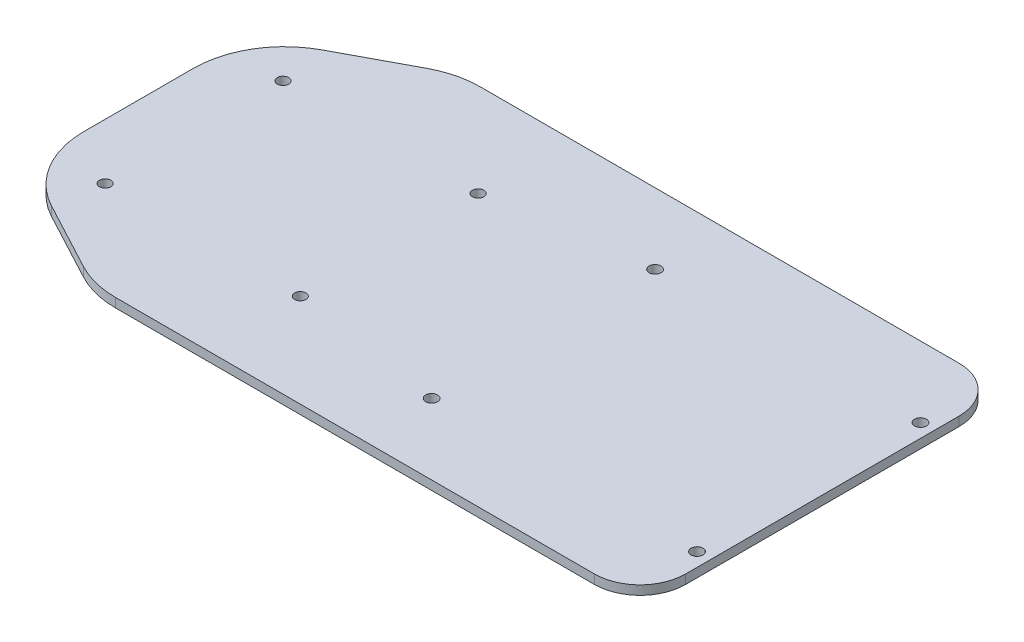
ISO-10303-21;
HEADER;
FILE_DESCRIPTION(('STEP AP214'),'2;1');
FILE_NAME('part.step','',(''),(''),'','','');
FILE_SCHEMA(('AUTOMOTIVE_DESIGN { 1 0 10303 214 1 1 1 1 }'));
ENDSEC;
DATA;
#1=APPLICATION_CONTEXT('core data for automotive mechanical design processes');
#2=APPLICATION_PROTOCOL_DEFINITION('international standard','automotive_design',2000,#1);
#3=PRODUCT_CONTEXT('',#1,'mechanical');
#4=PRODUCT('Part','Part','',(#3));
#5=PRODUCT_RELATED_PRODUCT_CATEGORY('part','',(#4));
#6=PRODUCT_DEFINITION_FORMATION('','',#4);
#7=PRODUCT_DEFINITION_CONTEXT('part definition',#1,'design');
#8=PRODUCT_DEFINITION('design','',#6,#7);
#9=PRODUCT_DEFINITION_SHAPE('','',#8);
#10=(LENGTH_UNIT() NAMED_UNIT(*) SI_UNIT(.MILLI.,.METRE.));
#11=(NAMED_UNIT(*) PLANE_ANGLE_UNIT() SI_UNIT($,.RADIAN.));
#12=(NAMED_UNIT(*) SI_UNIT($,.STERADIAN.) SOLID_ANGLE_UNIT());
#13=UNCERTAINTY_MEASURE_WITH_UNIT(LENGTH_MEASURE(1.E-05),#10,'distance_accuracy_value','');
#14=(GEOMETRIC_REPRESENTATION_CONTEXT(3) GLOBAL_UNCERTAINTY_ASSIGNED_CONTEXT((#13)) GLOBAL_UNIT_ASSIGNED_CONTEXT((#10,
#11,#12)) REPRESENTATION_CONTEXT('',''));
#15=CARTESIAN_POINT('',(0.,0.,0.));
#16=DIRECTION('',(0.,0.,1.));
#17=DIRECTION('',(1.,0.,0.));
#18=AXIS2_PLACEMENT_3D('',#15,#16,#17);
#19=CARTESIAN_POINT('',(0.,2.,0.));
#20=DIRECTION('',(0.,-1.,0.));
#21=DIRECTION('',(0.,0.,-1.));
#22=AXIS2_PLACEMENT_3D('',#19,#20,#21);
#23=PLANE('',#22);
#24=CARTESIAN_POINT('',(72.,2.,-24.5));
#25=DIRECTION('',(0.,1.,0.));
#26=DIRECTION('',(0.,0.,-1.));
#27=AXIS2_PLACEMENT_3D('',#24,#25,#26);
#28=CIRCLE('',#27,1.29999999999999);
#29=CARTESIAN_POINT('',(72.,2.,-25.8));
#30=VERTEX_POINT('',#29);
#31=EDGE_CURVE('E300',#30,#30,#28,.T.);
#32=ORIENTED_EDGE('',*,*,#31,.F.);
#33=EDGE_LOOP('',(#32));
#34=FACE_BOUND('',#33,.T.);
#35=CARTESIAN_POINT('',(13.8,2.,24.5));
#36=DIRECTION('',(0.,1.,0.));
#37=DIRECTION('',(0.,0.,-1.));
#38=AXIS2_PLACEMENT_3D('',#35,#36,#37);
#39=CIRCLE('',#38,1.3);
#40=CARTESIAN_POINT('',(13.8,2.,23.2));
#41=VERTEX_POINT('',#40);
#42=EDGE_CURVE('E309',#41,#41,#39,.T.);
#43=ORIENTED_EDGE('',*,*,#42,.F.);
#44=EDGE_LOOP('',(#43));
#45=FACE_BOUND('',#44,.T.);
#46=CARTESIAN_POINT('',(72.,2.,24.5));
#47=DIRECTION('',(0.,1.,0.));
#48=DIRECTION('',(0.,0.,1.));
#49=AXIS2_PLACEMENT_3D('',#46,#47,#48);
#50=CIRCLE('',#49,1.29999999999999);
#51=CARTESIAN_POINT('',(72.,2.,25.8));
#52=VERTEX_POINT('',#51);
#53=EDGE_CURVE('E285',#52,#52,#50,.T.);
#54=ORIENTED_EDGE('',*,*,#53,.F.);
#55=EDGE_LOOP('',(#54));
#56=FACE_BOUND('',#55,.T.);
#57=CARTESIAN_POINT('',(13.8,2.,-24.5));
#58=DIRECTION('',(0.,1.,0.));
#59=DIRECTION('',(0.,0.,1.));
#60=AXIS2_PLACEMENT_3D('',#57,#58,#59);
#61=CIRCLE('',#60,1.3);
#62=CARTESIAN_POINT('',(13.8,2.,-23.2));
#63=VERTEX_POINT('',#62);
#64=EDGE_CURVE('E304',#63,#63,#61,.T.);
#65=ORIENTED_EDGE('',*,*,#64,.F.);
#66=EDGE_LOOP('',(#65));
#67=FACE_BOUND('',#66,.T.);
#68=DIRECTION('',(0.,0.,-1.));
#69=VECTOR('',#68,1.);
#70=CARTESIAN_POINT('',(75.,2.,40.));
#71=LINE('',#70,#69);
#72=CARTESIAN_POINT('',(75.,2.,30.));
#73=VERTEX_POINT('',#72);
#74=CARTESIAN_POINT('',(75.,2.,-30.));
#75=VERTEX_POINT('',#74);
#76=EDGE_CURVE('E237',#73,#75,#71,.T.);
#77=ORIENTED_EDGE('',*,*,#76,.T.);
#78=CARTESIAN_POINT('',(65.,2.,-30.));
#79=DIRECTION('',(0.,-1.,0.));
#80=DIRECTION('',(0.,0.,-1.));
#81=AXIS2_PLACEMENT_3D('',#78,#79,#80);
#82=CIRCLE('',#81,10.);
#83=CARTESIAN_POINT('',(65.,2.,-40.));
#84=VERTEX_POINT('',#83);
#85=EDGE_CURVE('E51',#75,#84,#82,.F.);
#86=ORIENTED_EDGE('',*,*,#85,.T.);
#87=DIRECTION('',(-1.,0.,0.));
#88=VECTOR('',#87,1.);
#89=CARTESIAN_POINT('',(-75.,2.,-40.));
#90=LINE('',#89,#88);
#91=CARTESIAN_POINT('',(-40.,2.,-40.));
#92=VERTEX_POINT('',#91);
#93=EDGE_CURVE('E236',#84,#92,#90,.T.);
#94=ORIENTED_EDGE('',*,*,#93,.T.);
#95=CARTESIAN_POINT('',(-40.,2.,-20.));
#96=DIRECTION('',(0.,-1.,0.));
#97=DIRECTION('',(0.,0.,-1.));
#98=AXIS2_PLACEMENT_3D('',#95,#96,#97);
#99=CIRCLE('',#98,20.);
#100=CARTESIAN_POINT('',(-49.4117647058824,2.,-37.6470588235294));
#101=VERTEX_POINT('',#100);
#102=EDGE_CURVE('E163',#92,#101,#99,.F.);
#103=ORIENTED_EDGE('',*,*,#102,.T.);
#104=DIRECTION('',(0.882352941176471,0.,-0.470588235294118));
#105=VECTOR('',#104,1.);
#106=CARTESIAN_POINT('',(-45.,2.,-40.));
#107=LINE('',#106,#105);
#108=CARTESIAN_POINT('',(-64.4117647058824,2.,-29.6470588235294));
#109=VERTEX_POINT('',#108);
#110=EDGE_CURVE('E280',#109,#101,#107,.T.);
#111=ORIENTED_EDGE('',*,*,#110,.F.);
#112=CARTESIAN_POINT('',(-55.,2.,-12.));
#113=DIRECTION('',(0.,-1.,0.));
#114=DIRECTION('',(0.,0.,-1.));
#115=AXIS2_PLACEMENT_3D('',#112,#113,#114);
#116=CIRCLE('',#115,20.);
#117=CARTESIAN_POINT('',(-75.,2.,-12.));
#118=VERTEX_POINT('',#117);
#119=EDGE_CURVE('E180',#109,#118,#116,.F.);
#120=ORIENTED_EDGE('',*,*,#119,.T.);
#121=DIRECTION('',(0.,0.,1.));
#122=VECTOR('',#121,1.);
#123=CARTESIAN_POINT('',(-75.,2.,40.));
#124=LINE('',#123,#122);
#125=CARTESIAN_POINT('',(-75.,2.,12.));
#126=VERTEX_POINT('',#125);
#127=EDGE_CURVE('E172',#118,#126,#124,.T.);
#128=ORIENTED_EDGE('',*,*,#127,.T.);
#129=CARTESIAN_POINT('',(-55.,2.,12.));
#130=DIRECTION('',(0.,-1.,0.));
#131=DIRECTION('',(0.,0.,-1.));
#132=AXIS2_PLACEMENT_3D('',#129,#130,#131);
#133=CIRCLE('',#132,20.);
#134=CARTESIAN_POINT('',(-64.4117647058824,2.,29.6470588235294));
#135=VERTEX_POINT('',#134);
#136=EDGE_CURVE('E165',#126,#135,#133,.F.);
#137=ORIENTED_EDGE('',*,*,#136,.T.);
#138=DIRECTION('',(-0.882352941176471,0.,-0.470588235294118));
#139=VECTOR('',#138,1.);
#140=CARTESIAN_POINT('',(-45.,2.,40.));
#141=LINE('',#140,#139);
#142=CARTESIAN_POINT('',(-49.4117647058824,2.,37.6470588235294));
#143=VERTEX_POINT('',#142);
#144=EDGE_CURVE('E287',#143,#135,#141,.T.);
#145=ORIENTED_EDGE('',*,*,#144,.F.);
#146=CARTESIAN_POINT('',(-40.,2.,20.));
#147=DIRECTION('',(0.,-1.,0.));
#148=DIRECTION('',(0.,0.,-1.));
#149=AXIS2_PLACEMENT_3D('',#146,#147,#148);
#150=CIRCLE('',#149,20.);
#151=CARTESIAN_POINT('',(-40.,2.,40.));
#152=VERTEX_POINT('',#151);
#153=EDGE_CURVE('E170',#143,#152,#150,.F.);
#154=ORIENTED_EDGE('',*,*,#153,.T.);
#155=DIRECTION('',(1.,0.,0.));
#156=VECTOR('',#155,1.);
#157=CARTESIAN_POINT('',(-75.,2.,40.));
#158=LINE('',#157,#156);
#159=CARTESIAN_POINT('',(65.,2.,40.));
#160=VERTEX_POINT('',#159);
#161=EDGE_CURVE('E166',#152,#160,#158,.T.);
#162=ORIENTED_EDGE('',*,*,#161,.T.);
#163=CARTESIAN_POINT('',(65.,2.,30.));
#164=DIRECTION('',(0.,-1.,0.));
#165=DIRECTION('',(0.,0.,-1.));
#166=AXIS2_PLACEMENT_3D('',#163,#164,#165);
#167=CIRCLE('',#166,10.);
#168=EDGE_CURVE('E230',#160,#73,#167,.F.);
#169=ORIENTED_EDGE('',*,*,#168,.T.);
#170=EDGE_LOOP('',(#77,#86,#94,#103,#111,#120,#128,#137,#145,#154,#162,#169));
#171=FACE_BOUND('',#170,.T.);
#172=CARTESIAN_POINT('',(-62.8,2.,-19.5));
#173=DIRECTION('',(0.,1.,0.));
#174=DIRECTION('',(0.,0.,1.));
#175=AXIS2_PLACEMENT_3D('',#172,#173,#174);
#176=CIRCLE('',#175,1.25);
#177=CARTESIAN_POINT('',(-62.8,2.,-18.25));
#178=VERTEX_POINT('',#177);
#179=EDGE_CURVE('E246',#178,#178,#176,.T.);
#180=ORIENTED_EDGE('',*,*,#179,.F.);
#181=EDGE_LOOP('',(#180));
#182=FACE_BOUND('',#181,.T.);
#183=CARTESIAN_POINT('',(-20.,2.,-19.5));
#184=DIRECTION('',(0.,1.,0.));
#185=DIRECTION('',(0.,0.,-1.));
#186=AXIS2_PLACEMENT_3D('',#183,#184,#185);
#187=CIRCLE('',#186,1.25);
#188=CARTESIAN_POINT('',(-20.,2.,-20.75));
#189=VERTEX_POINT('',#188);
#190=EDGE_CURVE('E340',#189,#189,#187,.T.);
#191=ORIENTED_EDGE('',*,*,#190,.F.);
#192=EDGE_LOOP('',(#191));
#193=FACE_BOUND('',#192,.T.);
#194=CARTESIAN_POINT('',(-20.,2.,19.5));
#195=DIRECTION('',(0.,1.,0.));
#196=DIRECTION('',(0.,0.,1.));
#197=AXIS2_PLACEMENT_3D('',#194,#195,#196);
#198=CIRCLE('',#197,1.25);
#199=CARTESIAN_POINT('',(-20.,2.,20.75));
#200=VERTEX_POINT('',#199);
#201=EDGE_CURVE('E332',#200,#200,#198,.T.);
#202=ORIENTED_EDGE('',*,*,#201,.F.);
#203=EDGE_LOOP('',(#202));
#204=FACE_BOUND('',#203,.T.);
#205=CARTESIAN_POINT('',(-62.8,2.,19.5));
#206=DIRECTION('',(0.,1.,0.));
#207=DIRECTION('',(0.,0.,-1.));
#208=AXIS2_PLACEMENT_3D('',#205,#206,#207);
#209=CIRCLE('',#208,1.25);
#210=CARTESIAN_POINT('',(-62.8,2.,18.25));
#211=VERTEX_POINT('',#210);
#212=EDGE_CURVE('E324',#211,#211,#209,.T.);
#213=ORIENTED_EDGE('',*,*,#212,.F.);
#214=EDGE_LOOP('',(#213));
#215=FACE_BOUND('',#214,.T.);
#216=ADVANCED_FACE('F42',(#34,#45,#56,#67,#171,#182,#193,#204,#215),#23,.F.);
#217=CARTESIAN_POINT('',(0.,0.,0.));
#218=DIRECTION('',(0.,-1.,0.));
#219=DIRECTION('',(0.,0.,-1.));
#220=AXIS2_PLACEMENT_3D('',#217,#218,#219);
#221=PLANE('',#220);
#222=DIRECTION('',(-1.,0.,0.));
#223=VECTOR('',#222,1.);
#224=CARTESIAN_POINT('',(-75.,0.,-40.));
#225=LINE('',#224,#223);
#226=CARTESIAN_POINT('',(65.,0.,-40.));
#227=VERTEX_POINT('',#226);
#228=CARTESIAN_POINT('',(-40.,0.,-40.));
#229=VERTEX_POINT('',#228);
#230=EDGE_CURVE('E135',#227,#229,#225,.T.);
#231=ORIENTED_EDGE('',*,*,#230,.F.);
#232=CARTESIAN_POINT('',(65.,0.,-30.));
#233=DIRECTION('',(0.,-1.,0.));
#234=DIRECTION('',(0.,0.,-1.));
#235=AXIS2_PLACEMENT_3D('',#232,#233,#234);
#236=CIRCLE('',#235,10.);
#237=CARTESIAN_POINT('',(75.,0.,-30.));
#238=VERTEX_POINT('',#237);
#239=EDGE_CURVE('E221',#227,#238,#236,.T.);
#240=ORIENTED_EDGE('',*,*,#239,.T.);
#241=DIRECTION('',(0.,0.,-1.));
#242=VECTOR('',#241,1.);
#243=CARTESIAN_POINT('',(75.,0.,40.));
#244=LINE('',#243,#242);
#245=CARTESIAN_POINT('',(75.,0.,30.));
#246=VERTEX_POINT('',#245);
#247=EDGE_CURVE('E146',#246,#238,#244,.T.);
#248=ORIENTED_EDGE('',*,*,#247,.F.);
#249=CARTESIAN_POINT('',(65.,0.,30.));
#250=DIRECTION('',(0.,-1.,0.));
#251=DIRECTION('',(0.,0.,-1.));
#252=AXIS2_PLACEMENT_3D('',#249,#250,#251);
#253=CIRCLE('',#252,10.);
#254=CARTESIAN_POINT('',(65.,0.,40.));
#255=VERTEX_POINT('',#254);
#256=EDGE_CURVE('E218',#246,#255,#253,.T.);
#257=ORIENTED_EDGE('',*,*,#256,.T.);
#258=DIRECTION('',(1.,0.,0.));
#259=VECTOR('',#258,1.);
#260=CARTESIAN_POINT('',(-75.,0.,40.));
#261=LINE('',#260,#259);
#262=CARTESIAN_POINT('',(-40.,0.,40.));
#263=VERTEX_POINT('',#262);
#264=EDGE_CURVE('E175',#263,#255,#261,.T.);
#265=ORIENTED_EDGE('',*,*,#264,.F.);
#266=CARTESIAN_POINT('',(-40.,0.,20.));
#267=DIRECTION('',(0.,-1.,0.));
#268=DIRECTION('',(0.,0.,-1.));
#269=AXIS2_PLACEMENT_3D('',#266,#267,#268);
#270=CIRCLE('',#269,20.);
#271=CARTESIAN_POINT('',(-49.4117647058824,0.,37.6470588235294));
#272=VERTEX_POINT('',#271);
#273=EDGE_CURVE('E195',#263,#272,#270,.T.);
#274=ORIENTED_EDGE('',*,*,#273,.T.);
#275=DIRECTION('',(-0.882352941176471,0.,-0.470588235294118));
#276=VECTOR('',#275,1.);
#277=CARTESIAN_POINT('',(-45.,0.,40.));
#278=LINE('',#277,#276);
#279=CARTESIAN_POINT('',(-64.4117647058824,0.,29.6470588235294));
#280=VERTEX_POINT('',#279);
#281=EDGE_CURVE('E292',#272,#280,#278,.T.);
#282=ORIENTED_EDGE('',*,*,#281,.T.);
#283=CARTESIAN_POINT('',(-55.,0.,12.));
#284=DIRECTION('',(0.,-1.,0.));
#285=DIRECTION('',(0.,0.,-1.));
#286=AXIS2_PLACEMENT_3D('',#283,#284,#285);
#287=CIRCLE('',#286,20.);
#288=CARTESIAN_POINT('',(-75.,0.,12.));
#289=VERTEX_POINT('',#288);
#290=EDGE_CURVE('E192',#280,#289,#287,.T.);
#291=ORIENTED_EDGE('',*,*,#290,.T.);
#292=DIRECTION('',(0.,0.,1.));
#293=VECTOR('',#292,1.);
#294=CARTESIAN_POINT('',(-75.,0.,40.));
#295=LINE('',#294,#293);
#296=CARTESIAN_POINT('',(-75.,0.,-12.));
#297=VERTEX_POINT('',#296);
#298=EDGE_CURVE('E145',#297,#289,#295,.T.);
#299=ORIENTED_EDGE('',*,*,#298,.F.);
#300=CARTESIAN_POINT('',(-55.,0.,-12.));
#301=DIRECTION('',(0.,-1.,0.));
#302=DIRECTION('',(0.,0.,-1.));
#303=AXIS2_PLACEMENT_3D('',#300,#301,#302);
#304=CIRCLE('',#303,20.);
#305=CARTESIAN_POINT('',(-64.4117647058824,0.,-29.6470588235294));
#306=VERTEX_POINT('',#305);
#307=EDGE_CURVE('E159',#297,#306,#304,.T.);
#308=ORIENTED_EDGE('',*,*,#307,.T.);
#309=DIRECTION('',(0.882352941176471,0.,-0.470588235294118));
#310=VECTOR('',#309,1.);
#311=CARTESIAN_POINT('',(-45.,0.,-40.));
#312=LINE('',#311,#310);
#313=CARTESIAN_POINT('',(-49.4117647058824,0.,-37.6470588235294));
#314=VERTEX_POINT('',#313);
#315=EDGE_CURVE('E154',#306,#314,#312,.T.);
#316=ORIENTED_EDGE('',*,*,#315,.T.);
#317=CARTESIAN_POINT('',(-40.,0.,-20.));
#318=DIRECTION('',(0.,-1.,0.));
#319=DIRECTION('',(0.,0.,-1.));
#320=AXIS2_PLACEMENT_3D('',#317,#318,#319);
#321=CIRCLE('',#320,20.);
#322=EDGE_CURVE('E150',#314,#229,#321,.T.);
#323=ORIENTED_EDGE('',*,*,#322,.T.);
#324=EDGE_LOOP('',(#231,#240,#248,#257,#265,#274,#282,#291,#299,#308,#316,#323));
#325=FACE_BOUND('',#324,.T.);
#326=CARTESIAN_POINT('',(72.,0.,-24.5));
#327=DIRECTION('',(0.,1.,0.));
#328=DIRECTION('',(0.,0.,-1.));
#329=AXIS2_PLACEMENT_3D('',#326,#327,#328);
#330=CIRCLE('',#329,1.29999999999999);
#331=CARTESIAN_POINT('',(72.,0.,-25.8));
#332=VERTEX_POINT('',#331);
#333=EDGE_CURVE('E305',#332,#332,#330,.T.);
#334=ORIENTED_EDGE('',*,*,#333,.T.);
#335=EDGE_LOOP('',(#334));
#336=FACE_BOUND('',#335,.T.);
#337=CARTESIAN_POINT('',(13.8,0.,24.5));
#338=DIRECTION('',(0.,1.,0.));
#339=DIRECTION('',(0.,0.,-1.));
#340=AXIS2_PLACEMENT_3D('',#337,#338,#339);
#341=CIRCLE('',#340,1.3);
#342=CARTESIAN_POINT('',(13.8,0.,23.2));
#343=VERTEX_POINT('',#342);
#344=EDGE_CURVE('E298',#343,#343,#341,.T.);
#345=ORIENTED_EDGE('',*,*,#344,.T.);
#346=EDGE_LOOP('',(#345));
#347=FACE_BOUND('',#346,.T.);
#348=CARTESIAN_POINT('',(72.,0.,24.5));
#349=DIRECTION('',(0.,1.,0.));
#350=DIRECTION('',(0.,0.,1.));
#351=AXIS2_PLACEMENT_3D('',#348,#349,#350);
#352=CIRCLE('',#351,1.29999999999999);
#353=CARTESIAN_POINT('',(72.,0.,25.8));
#354=VERTEX_POINT('',#353);
#355=EDGE_CURVE('E279',#354,#354,#352,.T.);
#356=ORIENTED_EDGE('',*,*,#355,.T.);
#357=EDGE_LOOP('',(#356));
#358=FACE_BOUND('',#357,.T.);
#359=CARTESIAN_POINT('',(13.8,0.,-24.5));
#360=DIRECTION('',(0.,1.,0.));
#361=DIRECTION('',(0.,0.,1.));
#362=AXIS2_PLACEMENT_3D('',#359,#360,#361);
#363=CIRCLE('',#362,1.3);
#364=CARTESIAN_POINT('',(13.8,0.,-23.2));
#365=VERTEX_POINT('',#364);
#366=EDGE_CURVE('E316',#365,#365,#363,.T.);
#367=ORIENTED_EDGE('',*,*,#366,.T.);
#368=EDGE_LOOP('',(#367));
#369=FACE_BOUND('',#368,.T.);
#370=CARTESIAN_POINT('',(-20.,0.,19.5));
#371=DIRECTION('',(0.,1.,0.));
#372=DIRECTION('',(0.,0.,1.));
#373=AXIS2_PLACEMENT_3D('',#370,#371,#372);
#374=CIRCLE('',#373,1.25);
#375=CARTESIAN_POINT('',(-20.,0.,20.75));
#376=VERTEX_POINT('',#375);
#377=EDGE_CURVE('E328',#376,#376,#374,.T.);
#378=ORIENTED_EDGE('',*,*,#377,.T.);
#379=EDGE_LOOP('',(#378));
#380=FACE_BOUND('',#379,.T.);
#381=CARTESIAN_POINT('',(-62.8,0.,-19.5));
#382=DIRECTION('',(0.,1.,0.));
#383=DIRECTION('',(0.,0.,1.));
#384=AXIS2_PLACEMENT_3D('',#381,#382,#383);
#385=CIRCLE('',#384,1.25);
#386=CARTESIAN_POINT('',(-62.8,0.,-18.25));
#387=VERTEX_POINT('',#386);
#388=EDGE_CURVE('E250',#387,#387,#385,.T.);
#389=ORIENTED_EDGE('',*,*,#388,.T.);
#390=EDGE_LOOP('',(#389));
#391=FACE_BOUND('',#390,.T.);
#392=CARTESIAN_POINT('',(-20.,0.,-19.5));
#393=DIRECTION('',(0.,1.,0.));
#394=DIRECTION('',(0.,0.,-1.));
#395=AXIS2_PLACEMENT_3D('',#392,#393,#394);
#396=CIRCLE('',#395,1.25);
#397=CARTESIAN_POINT('',(-20.,0.,-20.75));
#398=VERTEX_POINT('',#397);
#399=EDGE_CURVE('E336',#398,#398,#396,.T.);
#400=ORIENTED_EDGE('',*,*,#399,.T.);
#401=EDGE_LOOP('',(#400));
#402=FACE_BOUND('',#401,.T.);
#403=CARTESIAN_POINT('',(-62.8,0.,19.5));
#404=DIRECTION('',(0.,1.,0.));
#405=DIRECTION('',(0.,0.,-1.));
#406=AXIS2_PLACEMENT_3D('',#403,#404,#405);
#407=CIRCLE('',#406,1.25);
#408=CARTESIAN_POINT('',(-62.8,0.,18.25));
#409=VERTEX_POINT('',#408);
#410=EDGE_CURVE('E320',#409,#409,#407,.T.);
#411=ORIENTED_EDGE('',*,*,#410,.T.);
#412=EDGE_LOOP('',(#411));
#413=FACE_BOUND('',#412,.T.);
#414=ADVANCED_FACE('F151',(#325,#336,#347,#358,#369,#380,#391,#402,#413),#221,.T.);
#415=CARTESIAN_POINT('',(75.,2.,40.));
#416=DIRECTION('',(-1.,0.,0.));
#417=DIRECTION('',(0.,0.,1.));
#418=AXIS2_PLACEMENT_3D('',#415,#416,#417);
#419=PLANE('',#418);
#420=ORIENTED_EDGE('',*,*,#247,.T.);
#421=DIRECTION('',(0.,-1.,0.));
#422=VECTOR('',#421,1.);
#423=CARTESIAN_POINT('',(75.,2.,-30.));
#424=LINE('',#423,#422);
#425=EDGE_CURVE('E64',#238,#75,#424,.F.);
#426=ORIENTED_EDGE('',*,*,#425,.T.);
#427=ORIENTED_EDGE('',*,*,#76,.F.);
#428=DIRECTION('',(0.,-1.,0.));
#429=VECTOR('',#428,1.);
#430=CARTESIAN_POINT('',(75.,2.,30.));
#431=LINE('',#430,#429);
#432=EDGE_CURVE('E224',#73,#246,#431,.T.);
#433=ORIENTED_EDGE('',*,*,#432,.T.);
#434=EDGE_LOOP('',(#420,#426,#427,#433));
#435=FACE_BOUND('',#434,.T.);
#436=ADVANCED_FACE('F243',(#435),#419,.F.);
#437=CARTESIAN_POINT('',(-75.,2.,-40.));
#438=DIRECTION('',(0.,0.,1.));
#439=DIRECTION('',(1.,0.,0.));
#440=AXIS2_PLACEMENT_3D('',#437,#438,#439);
#441=PLANE('',#440);
#442=ORIENTED_EDGE('',*,*,#93,.F.);
#443=DIRECTION('',(0.,-1.,0.));
#444=VECTOR('',#443,1.);
#445=CARTESIAN_POINT('',(65.,2.,-40.));
#446=LINE('',#445,#444);
#447=EDGE_CURVE('E142',#84,#227,#446,.T.);
#448=ORIENTED_EDGE('',*,*,#447,.T.);
#449=ORIENTED_EDGE('',*,*,#230,.T.);
#450=DIRECTION('',(0.,1.,0.));
#451=VECTOR('',#450,1.);
#452=CARTESIAN_POINT('',(-40.,2.,-40.));
#453=LINE('',#452,#451);
#454=EDGE_CURVE('E140',#229,#92,#453,.T.);
#455=ORIENTED_EDGE('',*,*,#454,.T.);
#456=EDGE_LOOP('',(#442,#448,#449,#455));
#457=FACE_BOUND('',#456,.T.);
#458=ADVANCED_FACE('F138',(#457),#441,.F.);
#459=CARTESIAN_POINT('',(-75.,2.,40.));
#460=DIRECTION('',(1.,0.,0.));
#461=DIRECTION('',(0.,0.,-1.));
#462=AXIS2_PLACEMENT_3D('',#459,#460,#461);
#463=PLANE('',#462);
#464=ORIENTED_EDGE('',*,*,#127,.F.);
#465=DIRECTION('',(0.,1.,0.));
#466=VECTOR('',#465,1.);
#467=CARTESIAN_POINT('',(-75.,2.,-12.));
#468=LINE('',#467,#466);
#469=EDGE_CURVE('E203',#118,#297,#468,.F.);
#470=ORIENTED_EDGE('',*,*,#469,.T.);
#471=ORIENTED_EDGE('',*,*,#298,.T.);
#472=DIRECTION('',(0.,1.,0.));
#473=VECTOR('',#472,1.);
#474=CARTESIAN_POINT('',(-75.,2.,12.));
#475=LINE('',#474,#473);
#476=EDGE_CURVE('E158',#289,#126,#475,.T.);
#477=ORIENTED_EDGE('',*,*,#476,.T.);
#478=EDGE_LOOP('',(#464,#470,#471,#477));
#479=FACE_BOUND('',#478,.T.);
#480=ADVANCED_FACE('F270',(#479),#463,.F.);
#481=CARTESIAN_POINT('',(-75.,2.,40.));
#482=DIRECTION('',(0.,0.,-1.));
#483=DIRECTION('',(-1.,0.,0.));
#484=AXIS2_PLACEMENT_3D('',#481,#482,#483);
#485=PLANE('',#484);
#486=ORIENTED_EDGE('',*,*,#264,.T.);
#487=DIRECTION('',(0.,-1.,0.));
#488=VECTOR('',#487,1.);
#489=CARTESIAN_POINT('',(65.,2.,40.));
#490=LINE('',#489,#488);
#491=EDGE_CURVE('E11',#255,#160,#490,.F.);
#492=ORIENTED_EDGE('',*,*,#491,.T.);
#493=ORIENTED_EDGE('',*,*,#161,.F.);
#494=DIRECTION('',(0.,1.,0.));
#495=VECTOR('',#494,1.);
#496=CARTESIAN_POINT('',(-40.,2.,40.));
#497=LINE('',#496,#495);
#498=EDGE_CURVE('E213',#152,#263,#497,.F.);
#499=ORIENTED_EDGE('',*,*,#498,.T.);
#500=EDGE_LOOP('',(#486,#492,#493,#499));
#501=FACE_BOUND('',#500,.T.);
#502=ADVANCED_FACE('F363',(#501),#485,.F.);
#503=CARTESIAN_POINT('',(-62.8,2.,-19.5));
#504=DIRECTION('',(0.,-1.,0.));
#505=DIRECTION('',(0.,0.,-1.));
#506=AXIS2_PLACEMENT_3D('',#503,#504,#505);
#507=CYLINDRICAL_SURFACE('',#506,1.25);
#508=ORIENTED_EDGE('',*,*,#179,.T.);
#509=EDGE_LOOP('',(#508));
#510=FACE_BOUND('',#509,.T.);
#511=ORIENTED_EDGE('',*,*,#388,.F.);
#512=EDGE_LOOP('',(#511));
#513=FACE_BOUND('',#512,.T.);
#514=ADVANCED_FACE('F353',(#510,#513),#507,.F.);
#515=CARTESIAN_POINT('',(-20.,2.,-19.5));
#516=DIRECTION('',(0.,-1.,0.));
#517=DIRECTION('',(0.,0.,-1.));
#518=AXIS2_PLACEMENT_3D('',#515,#516,#517);
#519=CYLINDRICAL_SURFACE('',#518,1.25);
#520=ORIENTED_EDGE('',*,*,#190,.T.);
#521=EDGE_LOOP('',(#520));
#522=FACE_BOUND('',#521,.T.);
#523=ORIENTED_EDGE('',*,*,#399,.F.);
#524=EDGE_LOOP('',(#523));
#525=FACE_BOUND('',#524,.T.);
#526=ADVANCED_FACE('F350',(#522,#525),#519,.F.);
#527=CARTESIAN_POINT('',(-20.,2.,19.5));
#528=DIRECTION('',(0.,-1.,0.));
#529=DIRECTION('',(0.,0.,-1.));
#530=AXIS2_PLACEMENT_3D('',#527,#528,#529);
#531=CYLINDRICAL_SURFACE('',#530,1.25);
#532=ORIENTED_EDGE('',*,*,#201,.T.);
#533=EDGE_LOOP('',(#532));
#534=FACE_BOUND('',#533,.T.);
#535=ORIENTED_EDGE('',*,*,#377,.F.);
#536=EDGE_LOOP('',(#535));
#537=FACE_BOUND('',#536,.T.);
#538=ADVANCED_FACE('F352',(#534,#537),#531,.F.);
#539=CARTESIAN_POINT('',(-62.8,2.,19.5));
#540=DIRECTION('',(0.,-1.,0.));
#541=DIRECTION('',(0.,0.,-1.));
#542=AXIS2_PLACEMENT_3D('',#539,#540,#541);
#543=CYLINDRICAL_SURFACE('',#542,1.25);
#544=ORIENTED_EDGE('',*,*,#212,.T.);
#545=EDGE_LOOP('',(#544));
#546=FACE_BOUND('',#545,.T.);
#547=ORIENTED_EDGE('',*,*,#410,.F.);
#548=EDGE_LOOP('',(#547));
#549=FACE_BOUND('',#548,.T.);
#550=ADVANCED_FACE('F360',(#546,#549),#543,.F.);
#551=CARTESIAN_POINT('',(13.8,0.,-24.5));
#552=DIRECTION('',(0.,1.,0.));
#553=DIRECTION('',(0.,0.,1.));
#554=AXIS2_PLACEMENT_3D('',#551,#552,#553);
#555=CYLINDRICAL_SURFACE('',#554,1.3);
#556=ORIENTED_EDGE('',*,*,#366,.F.);
#557=EDGE_LOOP('',(#556));
#558=FACE_BOUND('',#557,.T.);
#559=ORIENTED_EDGE('',*,*,#64,.T.);
#560=EDGE_LOOP('',(#559));
#561=FACE_BOUND('',#560,.T.);
#562=ADVANCED_FACE('F426',(#558,#561),#555,.F.);
#563=CARTESIAN_POINT('',(72.,0.,24.5));
#564=DIRECTION('',(0.,1.,0.));
#565=DIRECTION('',(0.,0.,1.));
#566=AXIS2_PLACEMENT_3D('',#563,#564,#565);
#567=CYLINDRICAL_SURFACE('',#566,1.29999999999999);
#568=ORIENTED_EDGE('',*,*,#355,.F.);
#569=EDGE_LOOP('',(#568));
#570=FACE_BOUND('',#569,.T.);
#571=ORIENTED_EDGE('',*,*,#53,.T.);
#572=EDGE_LOOP('',(#571));
#573=FACE_BOUND('',#572,.T.);
#574=ADVANCED_FACE('F424',(#570,#573),#567,.F.);
#575=CARTESIAN_POINT('',(13.8,0.,24.5));
#576=DIRECTION('',(0.,1.,0.));
#577=DIRECTION('',(0.,0.,1.));
#578=AXIS2_PLACEMENT_3D('',#575,#576,#577);
#579=CYLINDRICAL_SURFACE('',#578,1.3);
#580=ORIENTED_EDGE('',*,*,#344,.F.);
#581=EDGE_LOOP('',(#580));
#582=FACE_BOUND('',#581,.T.);
#583=ORIENTED_EDGE('',*,*,#42,.T.);
#584=EDGE_LOOP('',(#583));
#585=FACE_BOUND('',#584,.T.);
#586=ADVANCED_FACE('F420',(#582,#585),#579,.F.);
#587=CARTESIAN_POINT('',(72.,0.,-24.5));
#588=DIRECTION('',(0.,1.,0.));
#589=DIRECTION('',(0.,0.,1.));
#590=AXIS2_PLACEMENT_3D('',#587,#588,#589);
#591=CYLINDRICAL_SURFACE('',#590,1.29999999999999);
#592=ORIENTED_EDGE('',*,*,#333,.F.);
#593=EDGE_LOOP('',(#592));
#594=FACE_BOUND('',#593,.T.);
#595=ORIENTED_EDGE('',*,*,#31,.T.);
#596=EDGE_LOOP('',(#595));
#597=FACE_BOUND('',#596,.T.);
#598=ADVANCED_FACE('F413',(#594,#597),#591,.F.);
#599=CARTESIAN_POINT('',(-45.,0.,40.));
#600=DIRECTION('',(0.470588235294118,0.,-0.88235294117647));
#601=DIRECTION('',(-0.88235294117647,0.,-0.470588235294118));
#602=AXIS2_PLACEMENT_3D('',#599,#600,#601);
#603=PLANE('',#602);
#604=ORIENTED_EDGE('',*,*,#281,.F.);
#605=DIRECTION('',(0.,1.,0.));
#606=VECTOR('',#605,1.);
#607=CARTESIAN_POINT('',(-49.4117647058824,0.,37.6470588235294));
#608=LINE('',#607,#606);
#609=EDGE_CURVE('E209',#272,#143,#608,.T.);
#610=ORIENTED_EDGE('',*,*,#609,.T.);
#611=ORIENTED_EDGE('',*,*,#144,.T.);
#612=DIRECTION('',(0.,1.,0.));
#613=VECTOR('',#612,1.);
#614=CARTESIAN_POINT('',(-64.4117647058823,0.,29.6470588235294));
#615=LINE('',#614,#613);
#616=EDGE_CURVE('E206',#135,#280,#615,.F.);
#617=ORIENTED_EDGE('',*,*,#616,.T.);
#618=EDGE_LOOP('',(#604,#610,#611,#617));
#619=FACE_BOUND('',#618,.T.);
#620=ADVANCED_FACE('F410',(#619),#603,.F.);
#621=CARTESIAN_POINT('',(-45.,0.,-40.));
#622=DIRECTION('',(0.470588235294118,0.,0.88235294117647));
#623=DIRECTION('',(0.88235294117647,0.,-0.470588235294118));
#624=AXIS2_PLACEMENT_3D('',#621,#622,#623);
#625=PLANE('',#624);
#626=ORIENTED_EDGE('',*,*,#110,.T.);
#627=DIRECTION('',(0.,1.,0.));
#628=VECTOR('',#627,1.);
#629=CARTESIAN_POINT('',(-49.4117647058824,0.,-37.6470588235294));
#630=LINE('',#629,#628);
#631=EDGE_CURVE('E189',#101,#314,#630,.F.);
#632=ORIENTED_EDGE('',*,*,#631,.T.);
#633=ORIENTED_EDGE('',*,*,#315,.F.);
#634=DIRECTION('',(0.,1.,0.));
#635=VECTOR('',#634,1.);
#636=CARTESIAN_POINT('',(-64.4117647058823,0.,-29.6470588235294));
#637=LINE('',#636,#635);
#638=EDGE_CURVE('E185',#306,#109,#637,.T.);
#639=ORIENTED_EDGE('',*,*,#638,.T.);
#640=EDGE_LOOP('',(#626,#632,#633,#639));
#641=FACE_BOUND('',#640,.T.);
#642=ADVANCED_FACE('F277',(#641),#625,.F.);
#643=CARTESIAN_POINT('',(-40.,2.,-20.));
#644=DIRECTION('',(0.,1.,0.));
#645=DIRECTION('',(0.,0.,1.));
#646=AXIS2_PLACEMENT_3D('',#643,#644,#645);
#647=CYLINDRICAL_SURFACE('',#646,20.);
#648=ORIENTED_EDGE('',*,*,#322,.F.);
#649=ORIENTED_EDGE('',*,*,#631,.F.);
#650=ORIENTED_EDGE('',*,*,#102,.F.);
#651=ORIENTED_EDGE('',*,*,#454,.F.);
#652=EDGE_LOOP('',(#648,#649,#650,#651));
#653=FACE_BOUND('',#652,.T.);
#654=ADVANCED_FACE('F162',(#653),#647,.T.);
#655=CARTESIAN_POINT('',(-55.,0.,-12.));
#656=DIRECTION('',(0.,1.,0.));
#657=DIRECTION('',(0.,0.,1.));
#658=AXIS2_PLACEMENT_3D('',#655,#656,#657);
#659=CYLINDRICAL_SURFACE('',#658,20.);
#660=ORIENTED_EDGE('',*,*,#307,.F.);
#661=ORIENTED_EDGE('',*,*,#469,.F.);
#662=ORIENTED_EDGE('',*,*,#119,.F.);
#663=ORIENTED_EDGE('',*,*,#638,.F.);
#664=EDGE_LOOP('',(#660,#661,#662,#663));
#665=FACE_BOUND('',#664,.T.);
#666=ADVANCED_FACE('F273',(#665),#659,.T.);
#667=CARTESIAN_POINT('',(-40.,0.,20.));
#668=DIRECTION('',(0.,1.,0.));
#669=DIRECTION('',(0.,0.,1.));
#670=AXIS2_PLACEMENT_3D('',#667,#668,#669);
#671=CYLINDRICAL_SURFACE('',#670,20.);
#672=ORIENTED_EDGE('',*,*,#273,.F.);
#673=ORIENTED_EDGE('',*,*,#498,.F.);
#674=ORIENTED_EDGE('',*,*,#153,.F.);
#675=ORIENTED_EDGE('',*,*,#609,.F.);
#676=EDGE_LOOP('',(#672,#673,#674,#675));
#677=FACE_BOUND('',#676,.T.);
#678=ADVANCED_FACE('F389',(#677),#671,.T.);
#679=CARTESIAN_POINT('',(-55.,2.,12.));
#680=DIRECTION('',(0.,1.,0.));
#681=DIRECTION('',(0.,0.,1.));
#682=AXIS2_PLACEMENT_3D('',#679,#680,#681);
#683=CYLINDRICAL_SURFACE('',#682,20.);
#684=ORIENTED_EDGE('',*,*,#290,.F.);
#685=ORIENTED_EDGE('',*,*,#616,.F.);
#686=ORIENTED_EDGE('',*,*,#136,.F.);
#687=ORIENTED_EDGE('',*,*,#476,.F.);
#688=EDGE_LOOP('',(#684,#685,#686,#687));
#689=FACE_BOUND('',#688,.T.);
#690=ADVANCED_FACE('F392',(#689),#683,.T.);
#691=CARTESIAN_POINT('',(65.,2.,-30.));
#692=DIRECTION('',(0.,-1.,0.));
#693=DIRECTION('',(0.,0.,-1.));
#694=AXIS2_PLACEMENT_3D('',#691,#692,#693);
#695=CYLINDRICAL_SURFACE('',#694,10.);
#696=ORIENTED_EDGE('',*,*,#85,.F.);
#697=ORIENTED_EDGE('',*,*,#425,.F.);
#698=ORIENTED_EDGE('',*,*,#239,.F.);
#699=ORIENTED_EDGE('',*,*,#447,.F.);
#700=EDGE_LOOP('',(#696,#697,#698,#699));
#701=FACE_BOUND('',#700,.T.);
#702=ADVANCED_FACE('F241',(#701),#695,.T.);
#703=CARTESIAN_POINT('',(65.,2.,30.));
#704=DIRECTION('',(0.,-1.,0.));
#705=DIRECTION('',(0.,0.,-1.));
#706=AXIS2_PLACEMENT_3D('',#703,#704,#705);
#707=CYLINDRICAL_SURFACE('',#706,10.);
#708=ORIENTED_EDGE('',*,*,#168,.F.);
#709=ORIENTED_EDGE('',*,*,#491,.F.);
#710=ORIENTED_EDGE('',*,*,#256,.F.);
#711=ORIENTED_EDGE('',*,*,#432,.F.);
#712=EDGE_LOOP('',(#708,#709,#710,#711));
#713=FACE_BOUND('',#712,.T.);
#714=ADVANCED_FACE('F44',(#713),#707,.T.);
#715=CLOSED_SHELL('',(#216,#414,#436,#458,#480,#502,#514,#526,#538,#550,#562,#574,#586,#598,
#620,#642,#654,#666,#678,#690,#702,#714));
#716=MANIFOLD_SOLID_BREP('B2',#715);
#717=ADVANCED_BREP_SHAPE_REPRESENTATION('',(#18,#716),#14);
#718=SHAPE_DEFINITION_REPRESENTATION(#9,#717);
ENDSEC;
END-ISO-10303-21;
